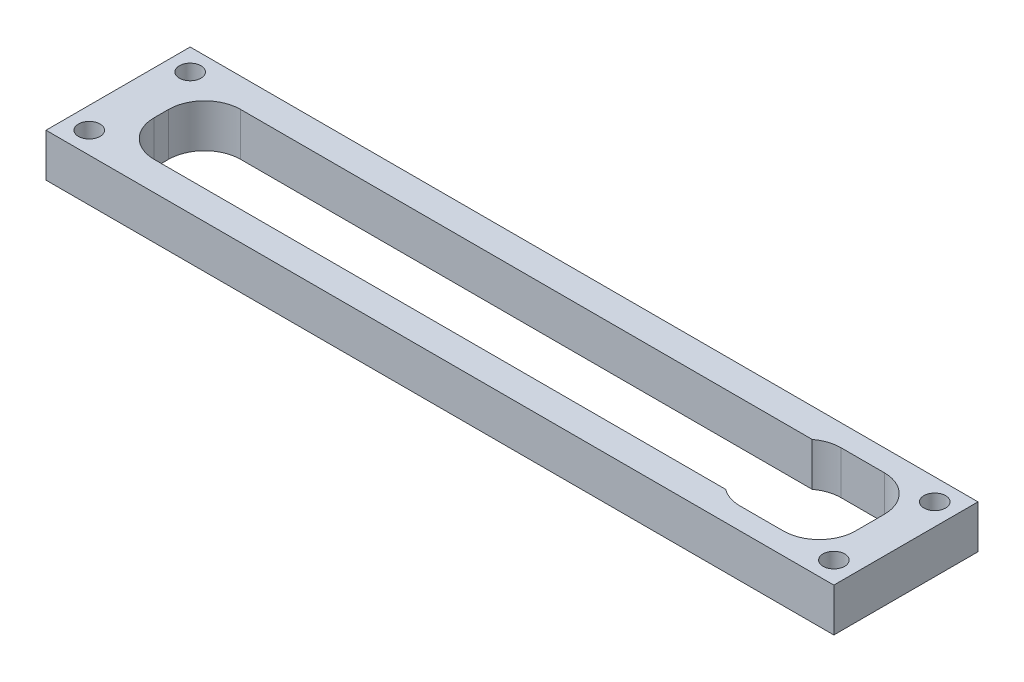
ISO-10303-21;
HEADER;
FILE_DESCRIPTION(('STEP AP214'),'2;1');
FILE_NAME('part.step','',(''),(''),'','','');
FILE_SCHEMA(('AUTOMOTIVE_DESIGN { 1 0 10303 214 1 1 1 1 }'));
ENDSEC;
DATA;
#1=APPLICATION_CONTEXT('core data for automotive mechanical design processes');
#2=APPLICATION_PROTOCOL_DEFINITION('international standard','automotive_design',2000,#1);
#3=PRODUCT_CONTEXT('',#1,'mechanical');
#4=PRODUCT('Part','Part','',(#3));
#5=PRODUCT_RELATED_PRODUCT_CATEGORY('part','',(#4));
#6=PRODUCT_DEFINITION_FORMATION('','',#4);
#7=PRODUCT_DEFINITION_CONTEXT('part definition',#1,'design');
#8=PRODUCT_DEFINITION('design','',#6,#7);
#9=PRODUCT_DEFINITION_SHAPE('','',#8);
#10=(LENGTH_UNIT() NAMED_UNIT(*) SI_UNIT(.MILLI.,.METRE.));
#11=(NAMED_UNIT(*) PLANE_ANGLE_UNIT() SI_UNIT($,.RADIAN.));
#12=(NAMED_UNIT(*) SI_UNIT($,.STERADIAN.) SOLID_ANGLE_UNIT());
#13=UNCERTAINTY_MEASURE_WITH_UNIT(LENGTH_MEASURE(1.E-05),#10,'distance_accuracy_value','');
#14=(GEOMETRIC_REPRESENTATION_CONTEXT(3) GLOBAL_UNCERTAINTY_ASSIGNED_CONTEXT((#13)) GLOBAL_UNIT_ASSIGNED_CONTEXT((#10,
#11,#12)) REPRESENTATION_CONTEXT('',''));
#15=CARTESIAN_POINT('',(0.,0.,0.));
#16=DIRECTION('',(0.,0.,1.));
#17=DIRECTION('',(1.,0.,0.));
#18=AXIS2_PLACEMENT_3D('',#15,#16,#17);
#19=CARTESIAN_POINT('',(0.,6.,0.));
#20=DIRECTION('',(0.,-1.,0.));
#21=DIRECTION('',(0.,0.,-1.));
#22=AXIS2_PLACEMENT_3D('',#19,#20,#21);
#23=PLANE('',#22);
#24=DIRECTION('',(0.,0.,1.));
#25=VECTOR('',#24,1.);
#26=CARTESIAN_POINT('',(0.,6.,0.));
#27=LINE('',#26,#25);
#28=CARTESIAN_POINT('',(0.,6.,-20.));
#29=VERTEX_POINT('',#28);
#30=CARTESIAN_POINT('',(0.,6.,0.));
#31=VERTEX_POINT('',#30);
#32=EDGE_CURVE('E250',#29,#31,#27,.T.);
#33=ORIENTED_EDGE('',*,*,#32,.T.);
#34=DIRECTION('',(1.,0.,0.));
#35=VECTOR('',#34,1.);
#36=CARTESIAN_POINT('',(0.,6.,0.));
#37=LINE('',#36,#35);
#38=CARTESIAN_POINT('',(109.295835398403,6.,0.));
#39=VERTEX_POINT('',#38);
#40=EDGE_CURVE('E253',#31,#39,#37,.T.);
#41=ORIENTED_EDGE('',*,*,#40,.T.);
#42=DIRECTION('',(0.,0.,-1.));
#43=VECTOR('',#42,1.);
#44=CARTESIAN_POINT('',(109.295835398403,6.,0.));
#45=LINE('',#44,#43);
#46=CARTESIAN_POINT('',(109.295835398403,6.,-20.));
#47=VERTEX_POINT('',#46);
#48=EDGE_CURVE('E256',#39,#47,#45,.T.);
#49=ORIENTED_EDGE('',*,*,#48,.T.);
#50=DIRECTION('',(-1.,0.,0.));
#51=VECTOR('',#50,1.);
#52=CARTESIAN_POINT('',(0.,6.,-20.));
#53=LINE('',#52,#51);
#54=EDGE_CURVE('E258',#47,#29,#53,.T.);
#55=ORIENTED_EDGE('',*,*,#54,.T.);
#56=EDGE_LOOP('',(#33,#41,#49,#55));
#57=FACE_BOUND('',#56,.T.);
#58=DIRECTION('',(-1.,0.,0.));
#59=VECTOR('',#58,1.);
#60=CARTESIAN_POINT('',(5.99999999999999,6.,-16.));
#61=LINE('',#60,#59);
#62=CARTESIAN_POINT('',(90.2958353984025,6.,-16.));
#63=VERTEX_POINT('',#62);
#64=CARTESIAN_POINT('',(11.,6.,-16.));
#65=VERTEX_POINT('',#64);
#66=EDGE_CURVE('E243',#63,#65,#61,.T.);
#67=ORIENTED_EDGE('',*,*,#66,.F.);
#68=CARTESIAN_POINT('',(93.2958353984026,6.,-12.));
#69=DIRECTION('',(0.,-1.,0.));
#70=DIRECTION('',(0.,0.,-1.));
#71=AXIS2_PLACEMENT_3D('',#68,#69,#70);
#72=CIRCLE('',#71,5.);
#73=CARTESIAN_POINT('',(93.2958353984026,6.,-17.));
#74=VERTEX_POINT('',#73);
#75=EDGE_CURVE('E193',#63,#74,#72,.T.);
#76=ORIENTED_EDGE('',*,*,#75,.T.);
#77=DIRECTION('',(-1.,0.,0.));
#78=VECTOR('',#77,1.);
#79=CARTESIAN_POINT('',(90.2958353984025,6.,-17.));
#80=LINE('',#79,#78);
#81=CARTESIAN_POINT('',(99.2958353984025,6.,-17.));
#82=VERTEX_POINT('',#81);
#83=EDGE_CURVE('E205',#82,#74,#80,.T.);
#84=ORIENTED_EDGE('',*,*,#83,.F.);
#85=CARTESIAN_POINT('',(99.2958353984025,6.,-12.));
#86=DIRECTION('',(0.,-1.,0.));
#87=DIRECTION('',(0.,0.,-1.));
#88=AXIS2_PLACEMENT_3D('',#85,#86,#87);
#89=CIRCLE('',#88,5.);
#90=CARTESIAN_POINT('',(104.295835398403,6.,-12.));
#91=VERTEX_POINT('',#90);
#92=EDGE_CURVE('E185',#82,#91,#89,.T.);
#93=ORIENTED_EDGE('',*,*,#92,.T.);
#94=DIRECTION('',(0.,0.,-1.));
#95=VECTOR('',#94,1.);
#96=CARTESIAN_POINT('',(104.295835398403,6.,-17.));
#97=LINE('',#96,#95);
#98=CARTESIAN_POINT('',(104.295835398403,6.,-8.00000000000001));
#99=VERTEX_POINT('',#98);
#100=EDGE_CURVE('E202',#99,#91,#97,.T.);
#101=ORIENTED_EDGE('',*,*,#100,.F.);
#102=CARTESIAN_POINT('',(99.2958353984025,6.,-8.00000000000001));
#103=DIRECTION('',(0.,-1.,0.));
#104=DIRECTION('',(0.,0.,-1.));
#105=AXIS2_PLACEMENT_3D('',#102,#103,#104);
#106=CIRCLE('',#105,5.);
#107=CARTESIAN_POINT('',(99.2958353984025,6.,-3.00000000000001));
#108=VERTEX_POINT('',#107);
#109=EDGE_CURVE('E189',#99,#108,#106,.T.);
#110=ORIENTED_EDGE('',*,*,#109,.T.);
#111=DIRECTION('',(1.,0.,0.));
#112=VECTOR('',#111,1.);
#113=CARTESIAN_POINT('',(90.2958353984025,6.,-3.));
#114=LINE('',#113,#112);
#115=CARTESIAN_POINT('',(93.2958353984026,6.,-3.00000000000001));
#116=VERTEX_POINT('',#115);
#117=EDGE_CURVE('E200',#116,#108,#114,.T.);
#118=ORIENTED_EDGE('',*,*,#117,.F.);
#119=CARTESIAN_POINT('',(93.2958353984026,6.,-8.00000000000001));
#120=DIRECTION('',(0.,-1.,0.));
#121=DIRECTION('',(0.,0.,-1.));
#122=AXIS2_PLACEMENT_3D('',#119,#120,#121);
#123=CIRCLE('',#122,5.);
#124=CARTESIAN_POINT('',(90.2958353984025,6.,-4.00000000000002));
#125=VERTEX_POINT('',#124);
#126=EDGE_CURVE('E43',#116,#125,#123,.T.);
#127=ORIENTED_EDGE('',*,*,#126,.T.);
#128=DIRECTION('',(1.,0.,0.));
#129=VECTOR('',#128,1.);
#130=CARTESIAN_POINT('',(5.99999999999999,6.,-4.00000000000002));
#131=LINE('',#130,#129);
#132=CARTESIAN_POINT('',(11.,6.,-4.00000000000002));
#133=VERTEX_POINT('',#132);
#134=EDGE_CURVE('E162',#133,#125,#131,.T.);
#135=ORIENTED_EDGE('',*,*,#134,.F.);
#136=CARTESIAN_POINT('',(11.,6.,-9.00000000000001));
#137=DIRECTION('',(0.,-1.,0.));
#138=DIRECTION('',(0.,0.,-1.));
#139=AXIS2_PLACEMENT_3D('',#136,#137,#138);
#140=CIRCLE('',#139,5.);
#141=CARTESIAN_POINT('',(5.99999999999999,6.,-9.00000000000001));
#142=VERTEX_POINT('',#141);
#143=EDGE_CURVE('E179',#133,#142,#140,.T.);
#144=ORIENTED_EDGE('',*,*,#143,.T.);
#145=DIRECTION('',(0.,0.,1.));
#146=VECTOR('',#145,1.);
#147=CARTESIAN_POINT('',(5.99999999999999,6.,-16.));
#148=LINE('',#147,#146);
#149=CARTESIAN_POINT('',(5.99999999999999,6.,-11.));
#150=VERTEX_POINT('',#149);
#151=EDGE_CURVE('E239',#150,#142,#148,.T.);
#152=ORIENTED_EDGE('',*,*,#151,.F.);
#153=CARTESIAN_POINT('',(11.,6.,-11.));
#154=DIRECTION('',(0.,-1.,0.));
#155=DIRECTION('',(0.,0.,-1.));
#156=AXIS2_PLACEMENT_3D('',#153,#154,#155);
#157=CIRCLE('',#156,5.);
#158=EDGE_CURVE('E183',#150,#65,#157,.T.);
#159=ORIENTED_EDGE('',*,*,#158,.T.);
#160=EDGE_LOOP('',(#67,#76,#84,#93,#101,#110,#118,#127,#135,#144,#152,#159));
#161=FACE_BOUND('',#160,.T.);
#162=CARTESIAN_POINT('',(3.,6.,-17.));
#163=DIRECTION('',(0.,1.,0.));
#164=DIRECTION('',(0.,0.,1.));
#165=AXIS2_PLACEMENT_3D('',#162,#163,#164);
#166=CIRCLE('',#165,1.5);
#167=CARTESIAN_POINT('',(3.,6.,-15.5));
#168=VERTEX_POINT('',#167);
#169=EDGE_CURVE('E234',#168,#168,#166,.T.);
#170=ORIENTED_EDGE('',*,*,#169,.F.);
#171=EDGE_LOOP('',(#170));
#172=FACE_BOUND('',#171,.T.);
#173=CARTESIAN_POINT('',(3.,6.,-3.));
#174=DIRECTION('',(0.,1.,0.));
#175=DIRECTION('',(0.,0.,-1.));
#176=AXIS2_PLACEMENT_3D('',#173,#174,#175);
#177=CIRCLE('',#176,1.5);
#178=CARTESIAN_POINT('',(3.,6.,-4.5));
#179=VERTEX_POINT('',#178);
#180=EDGE_CURVE('E228',#179,#179,#177,.T.);
#181=ORIENTED_EDGE('',*,*,#180,.F.);
#182=EDGE_LOOP('',(#181));
#183=FACE_BOUND('',#182,.T.);
#184=CARTESIAN_POINT('',(106.295835398403,6.,-3.00000000000001));
#185=DIRECTION('',(0.,1.,0.));
#186=DIRECTION('',(0.,0.,1.));
#187=AXIS2_PLACEMENT_3D('',#184,#185,#186);
#188=CIRCLE('',#187,1.5);
#189=CARTESIAN_POINT('',(106.295835398403,6.,-1.50000000000001));
#190=VERTEX_POINT('',#189);
#191=EDGE_CURVE('E222',#190,#190,#188,.T.);
#192=ORIENTED_EDGE('',*,*,#191,.F.);
#193=EDGE_LOOP('',(#192));
#194=FACE_BOUND('',#193,.T.);
#195=CARTESIAN_POINT('',(106.295835398403,6.,-17.));
#196=DIRECTION('',(0.,1.,0.));
#197=DIRECTION('',(0.,0.,-1.));
#198=AXIS2_PLACEMENT_3D('',#195,#196,#197);
#199=CIRCLE('',#198,1.5);
#200=CARTESIAN_POINT('',(106.295835398403,6.,-18.5));
#201=VERTEX_POINT('',#200);
#202=EDGE_CURVE('E216',#201,#201,#199,.T.);
#203=ORIENTED_EDGE('',*,*,#202,.F.);
#204=EDGE_LOOP('',(#203));
#205=FACE_BOUND('',#204,.T.);
#206=ADVANCED_FACE('F35',(#57,#161,#172,#183,#194,#205),#23,.F.);
#207=CARTESIAN_POINT('',(0.,0.,0.));
#208=DIRECTION('',(0.,-1.,0.));
#209=DIRECTION('',(0.,0.,-1.));
#210=AXIS2_PLACEMENT_3D('',#207,#208,#209);
#211=PLANE('',#210);
#212=DIRECTION('',(-1.,0.,0.));
#213=VECTOR('',#212,1.);
#214=CARTESIAN_POINT('',(90.2958353984025,0.,-17.));
#215=LINE('',#214,#213);
#216=CARTESIAN_POINT('',(99.2958353984025,0.,-17.));
#217=VERTEX_POINT('',#216);
#218=CARTESIAN_POINT('',(93.2958353984026,0.,-17.));
#219=VERTEX_POINT('',#218);
#220=EDGE_CURVE('E165',#217,#219,#215,.T.);
#221=ORIENTED_EDGE('',*,*,#220,.T.);
#222=CARTESIAN_POINT('',(93.2958353984026,0.,-12.));
#223=DIRECTION('',(0.,-1.,0.));
#224=DIRECTION('',(0.,0.,-1.));
#225=AXIS2_PLACEMENT_3D('',#222,#223,#224);
#226=CIRCLE('',#225,5.);
#227=CARTESIAN_POINT('',(90.2958353984025,0.,-16.));
#228=VERTEX_POINT('',#227);
#229=EDGE_CURVE('E195',#219,#228,#226,.F.);
#230=ORIENTED_EDGE('',*,*,#229,.T.);
#231=DIRECTION('',(-1.,0.,0.));
#232=VECTOR('',#231,1.);
#233=CARTESIAN_POINT('',(5.99999999999999,0.,-16.));
#234=LINE('',#233,#232);
#235=CARTESIAN_POINT('',(11.,0.,-16.));
#236=VERTEX_POINT('',#235);
#237=EDGE_CURVE('E154',#228,#236,#234,.T.);
#238=ORIENTED_EDGE('',*,*,#237,.T.);
#239=CARTESIAN_POINT('',(11.,0.,-11.));
#240=DIRECTION('',(0.,-1.,0.));
#241=DIRECTION('',(0.,0.,-1.));
#242=AXIS2_PLACEMENT_3D('',#239,#240,#241);
#243=CIRCLE('',#242,5.);
#244=CARTESIAN_POINT('',(5.99999999999999,0.,-11.));
#245=VERTEX_POINT('',#244);
#246=EDGE_CURVE('E181',#236,#245,#243,.F.);
#247=ORIENTED_EDGE('',*,*,#246,.T.);
#248=DIRECTION('',(0.,0.,1.));
#249=VECTOR('',#248,1.);
#250=CARTESIAN_POINT('',(5.99999999999999,0.,-16.));
#251=LINE('',#250,#249);
#252=CARTESIAN_POINT('',(5.99999999999999,0.,-9.00000000000001));
#253=VERTEX_POINT('',#252);
#254=EDGE_CURVE('E155',#245,#253,#251,.T.);
#255=ORIENTED_EDGE('',*,*,#254,.T.);
#256=CARTESIAN_POINT('',(11.,0.,-9.00000000000001));
#257=DIRECTION('',(0.,-1.,0.));
#258=DIRECTION('',(0.,0.,-1.));
#259=AXIS2_PLACEMENT_3D('',#256,#257,#258);
#260=CIRCLE('',#259,5.);
#261=CARTESIAN_POINT('',(11.,0.,-4.00000000000002));
#262=VERTEX_POINT('',#261);
#263=EDGE_CURVE('E151',#253,#262,#260,.F.);
#264=ORIENTED_EDGE('',*,*,#263,.T.);
#265=DIRECTION('',(1.,0.,0.));
#266=VECTOR('',#265,1.);
#267=CARTESIAN_POINT('',(5.99999999999999,0.,-4.00000000000002));
#268=LINE('',#267,#266);
#269=CARTESIAN_POINT('',(90.2958353984025,0.,-4.00000000000002));
#270=VERTEX_POINT('',#269);
#271=EDGE_CURVE('E145',#262,#270,#268,.T.);
#272=ORIENTED_EDGE('',*,*,#271,.T.);
#273=CARTESIAN_POINT('',(93.2958353984026,0.,-8.00000000000001));
#274=DIRECTION('',(0.,-1.,0.));
#275=DIRECTION('',(0.,0.,-1.));
#276=AXIS2_PLACEMENT_3D('',#273,#274,#275);
#277=CIRCLE('',#276,5.);
#278=CARTESIAN_POINT('',(93.2958353984026,0.,-3.00000000000001));
#279=VERTEX_POINT('',#278);
#280=EDGE_CURVE('E11',#270,#279,#277,.F.);
#281=ORIENTED_EDGE('',*,*,#280,.T.);
#282=DIRECTION('',(1.,0.,0.));
#283=VECTOR('',#282,1.);
#284=CARTESIAN_POINT('',(90.2958353984025,0.,-3.));
#285=LINE('',#284,#283);
#286=CARTESIAN_POINT('',(99.2958353984025,0.,-3.00000000000001));
#287=VERTEX_POINT('',#286);
#288=EDGE_CURVE('E212',#279,#287,#285,.T.);
#289=ORIENTED_EDGE('',*,*,#288,.T.);
#290=CARTESIAN_POINT('',(99.2958353984025,0.,-8.00000000000001));
#291=DIRECTION('',(0.,-1.,0.));
#292=DIRECTION('',(0.,0.,-1.));
#293=AXIS2_PLACEMENT_3D('',#290,#291,#292);
#294=CIRCLE('',#293,5.);
#295=CARTESIAN_POINT('',(104.295835398403,0.,-8.00000000000001));
#296=VERTEX_POINT('',#295);
#297=EDGE_CURVE('E191',#287,#296,#294,.F.);
#298=ORIENTED_EDGE('',*,*,#297,.T.);
#299=DIRECTION('',(0.,0.,-1.));
#300=VECTOR('',#299,1.);
#301=CARTESIAN_POINT('',(104.295835398403,0.,-17.));
#302=LINE('',#301,#300);
#303=CARTESIAN_POINT('',(104.295835398403,0.,-12.));
#304=VERTEX_POINT('',#303);
#305=EDGE_CURVE('E300',#296,#304,#302,.T.);
#306=ORIENTED_EDGE('',*,*,#305,.T.);
#307=CARTESIAN_POINT('',(99.2958353984025,0.,-12.));
#308=DIRECTION('',(0.,-1.,0.));
#309=DIRECTION('',(0.,0.,-1.));
#310=AXIS2_PLACEMENT_3D('',#307,#308,#309);
#311=CIRCLE('',#310,5.);
#312=EDGE_CURVE('E187',#304,#217,#311,.F.);
#313=ORIENTED_EDGE('',*,*,#312,.T.);
#314=EDGE_LOOP('',(#221,#230,#238,#247,#255,#264,#272,#281,#289,#298,#306,#313));
#315=FACE_BOUND('',#314,.T.);
#316=CARTESIAN_POINT('',(106.295835398403,0.,-3.00000000000001));
#317=DIRECTION('',(0.,1.,0.));
#318=DIRECTION('',(0.,0.,1.));
#319=AXIS2_PLACEMENT_3D('',#316,#317,#318);
#320=CIRCLE('',#319,1.5);
#321=CARTESIAN_POINT('',(106.295835398403,0.,-1.50000000000001));
#322=VERTEX_POINT('',#321);
#323=EDGE_CURVE('E219',#322,#322,#320,.T.);
#324=ORIENTED_EDGE('',*,*,#323,.T.);
#325=EDGE_LOOP('',(#324));
#326=FACE_BOUND('',#325,.T.);
#327=CARTESIAN_POINT('',(3.,0.,-17.));
#328=DIRECTION('',(0.,1.,0.));
#329=DIRECTION('',(0.,0.,1.));
#330=AXIS2_PLACEMENT_3D('',#327,#328,#329);
#331=CIRCLE('',#330,1.5);
#332=CARTESIAN_POINT('',(3.,0.,-15.5));
#333=VERTEX_POINT('',#332);
#334=EDGE_CURVE('E231',#333,#333,#331,.T.);
#335=ORIENTED_EDGE('',*,*,#334,.T.);
#336=EDGE_LOOP('',(#335));
#337=FACE_BOUND('',#336,.T.);
#338=DIRECTION('',(0.,0.,1.));
#339=VECTOR('',#338,1.);
#340=CARTESIAN_POINT('',(0.,0.,0.));
#341=LINE('',#340,#339);
#342=CARTESIAN_POINT('',(0.,0.,-20.));
#343=VERTEX_POINT('',#342);
#344=CARTESIAN_POINT('',(0.,0.,0.));
#345=VERTEX_POINT('',#344);
#346=EDGE_CURVE('E246',#343,#345,#341,.T.);
#347=ORIENTED_EDGE('',*,*,#346,.F.);
#348=DIRECTION('',(-1.,0.,0.));
#349=VECTOR('',#348,1.);
#350=CARTESIAN_POINT('',(0.,0.,-20.));
#351=LINE('',#350,#349);
#352=CARTESIAN_POINT('',(109.295835398403,0.,-20.));
#353=VERTEX_POINT('',#352);
#354=EDGE_CURVE('E254',#353,#343,#351,.T.);
#355=ORIENTED_EDGE('',*,*,#354,.F.);
#356=DIRECTION('',(0.,0.,-1.));
#357=VECTOR('',#356,1.);
#358=CARTESIAN_POINT('',(109.295835398403,0.,0.));
#359=LINE('',#358,#357);
#360=CARTESIAN_POINT('',(109.295835398403,0.,0.));
#361=VERTEX_POINT('',#360);
#362=EDGE_CURVE('E265',#361,#353,#359,.T.);
#363=ORIENTED_EDGE('',*,*,#362,.F.);
#364=DIRECTION('',(1.,0.,0.));
#365=VECTOR('',#364,1.);
#366=CARTESIAN_POINT('',(0.,0.,0.));
#367=LINE('',#366,#365);
#368=EDGE_CURVE('E263',#345,#361,#367,.T.);
#369=ORIENTED_EDGE('',*,*,#368,.F.);
#370=EDGE_LOOP('',(#347,#355,#363,#369));
#371=FACE_BOUND('',#370,.T.);
#372=CARTESIAN_POINT('',(3.,0.,-3.));
#373=DIRECTION('',(0.,1.,0.));
#374=DIRECTION('',(0.,0.,-1.));
#375=AXIS2_PLACEMENT_3D('',#372,#373,#374);
#376=CIRCLE('',#375,1.5);
#377=CARTESIAN_POINT('',(3.,0.,-4.5));
#378=VERTEX_POINT('',#377);
#379=EDGE_CURVE('E225',#378,#378,#376,.T.);
#380=ORIENTED_EDGE('',*,*,#379,.T.);
#381=EDGE_LOOP('',(#380));
#382=FACE_BOUND('',#381,.T.);
#383=CARTESIAN_POINT('',(106.295835398403,0.,-17.));
#384=DIRECTION('',(0.,1.,0.));
#385=DIRECTION('',(0.,0.,-1.));
#386=AXIS2_PLACEMENT_3D('',#383,#384,#385);
#387=CIRCLE('',#386,1.5);
#388=CARTESIAN_POINT('',(106.295835398403,0.,-18.5));
#389=VERTEX_POINT('',#388);
#390=EDGE_CURVE('E214',#389,#389,#387,.T.);
#391=ORIENTED_EDGE('',*,*,#390,.T.);
#392=EDGE_LOOP('',(#391));
#393=FACE_BOUND('',#392,.T.);
#394=ADVANCED_FACE('F148',(#315,#326,#337,#371,#382,#393),#211,.T.);
#395=CARTESIAN_POINT('',(0.,6.,0.));
#396=DIRECTION('',(1.,0.,0.));
#397=DIRECTION('',(0.,0.,-1.));
#398=AXIS2_PLACEMENT_3D('',#395,#396,#397);
#399=PLANE('',#398);
#400=ORIENTED_EDGE('',*,*,#346,.T.);
#401=DIRECTION('',(0.,-1.,0.));
#402=VECTOR('',#401,1.);
#403=CARTESIAN_POINT('',(0.,6.,0.));
#404=LINE('',#403,#402);
#405=EDGE_CURVE('E276',#31,#345,#404,.T.);
#406=ORIENTED_EDGE('',*,*,#405,.F.);
#407=ORIENTED_EDGE('',*,*,#32,.F.);
#408=DIRECTION('',(0.,-1.,0.));
#409=VECTOR('',#408,1.);
#410=CARTESIAN_POINT('',(0.,6.,-20.));
#411=LINE('',#410,#409);
#412=EDGE_CURVE('E260',#29,#343,#411,.T.);
#413=ORIENTED_EDGE('',*,*,#412,.T.);
#414=EDGE_LOOP('',(#400,#406,#407,#413));
#415=FACE_BOUND('',#414,.T.);
#416=ADVANCED_FACE('F331',(#415),#399,.F.);
#417=CARTESIAN_POINT('',(0.,6.,0.));
#418=DIRECTION('',(0.,0.,-1.));
#419=DIRECTION('',(-1.,0.,0.));
#420=AXIS2_PLACEMENT_3D('',#417,#418,#419);
#421=PLANE('',#420);
#422=ORIENTED_EDGE('',*,*,#368,.T.);
#423=DIRECTION('',(0.,-1.,0.));
#424=VECTOR('',#423,1.);
#425=CARTESIAN_POINT('',(109.295835398403,6.,0.));
#426=LINE('',#425,#424);
#427=EDGE_CURVE('E273',#39,#361,#426,.T.);
#428=ORIENTED_EDGE('',*,*,#427,.F.);
#429=ORIENTED_EDGE('',*,*,#40,.F.);
#430=ORIENTED_EDGE('',*,*,#405,.T.);
#431=EDGE_LOOP('',(#422,#428,#429,#430));
#432=FACE_BOUND('',#431,.T.);
#433=ADVANCED_FACE('F344',(#432),#421,.F.);
#434=CARTESIAN_POINT('',(109.295835398403,6.,0.));
#435=DIRECTION('',(-1.,0.,0.));
#436=DIRECTION('',(0.,0.,1.));
#437=AXIS2_PLACEMENT_3D('',#434,#435,#436);
#438=PLANE('',#437);
#439=ORIENTED_EDGE('',*,*,#362,.T.);
#440=DIRECTION('',(0.,-1.,0.));
#441=VECTOR('',#440,1.);
#442=CARTESIAN_POINT('',(109.295835398403,6.,-20.));
#443=LINE('',#442,#441);
#444=EDGE_CURVE('E270',#47,#353,#443,.T.);
#445=ORIENTED_EDGE('',*,*,#444,.F.);
#446=ORIENTED_EDGE('',*,*,#48,.F.);
#447=ORIENTED_EDGE('',*,*,#427,.T.);
#448=EDGE_LOOP('',(#439,#445,#446,#447));
#449=FACE_BOUND('',#448,.T.);
#450=ADVANCED_FACE('F340',(#449),#438,.F.);
#451=CARTESIAN_POINT('',(0.,6.,-20.));
#452=DIRECTION('',(0.,0.,1.));
#453=DIRECTION('',(1.,0.,0.));
#454=AXIS2_PLACEMENT_3D('',#451,#452,#453);
#455=PLANE('',#454);
#456=ORIENTED_EDGE('',*,*,#354,.T.);
#457=ORIENTED_EDGE('',*,*,#412,.F.);
#458=ORIENTED_EDGE('',*,*,#54,.F.);
#459=ORIENTED_EDGE('',*,*,#444,.T.);
#460=EDGE_LOOP('',(#456,#457,#458,#459));
#461=FACE_BOUND('',#460,.T.);
#462=ADVANCED_FACE('F337',(#461),#455,.F.);
#463=CARTESIAN_POINT('',(5.99999999999999,6.,-16.));
#464=DIRECTION('',(1.,0.,0.));
#465=DIRECTION('',(0.,0.,-1.));
#466=AXIS2_PLACEMENT_3D('',#463,#464,#465);
#467=PLANE('',#466);
#468=ORIENTED_EDGE('',*,*,#151,.T.);
#469=DIRECTION('',(0.,-1.,0.));
#470=VECTOR('',#469,1.);
#471=CARTESIAN_POINT('',(5.99999999999999,0.,-9.00000000000001));
#472=LINE('',#471,#470);
#473=EDGE_CURVE('E281',#142,#253,#472,.T.);
#474=ORIENTED_EDGE('',*,*,#473,.T.);
#475=ORIENTED_EDGE('',*,*,#254,.F.);
#476=DIRECTION('',(0.,-1.,0.));
#477=VECTOR('',#476,1.);
#478=CARTESIAN_POINT('',(5.99999999999999,6.,-11.));
#479=LINE('',#478,#477);
#480=EDGE_CURVE('E279',#245,#150,#479,.F.);
#481=ORIENTED_EDGE('',*,*,#480,.T.);
#482=EDGE_LOOP('',(#468,#474,#475,#481));
#483=FACE_BOUND('',#482,.T.);
#484=ADVANCED_FACE('F334',(#483),#467,.T.);
#485=CARTESIAN_POINT('',(5.99999999999999,6.,-4.00000000000002));
#486=DIRECTION('',(0.,0.,-1.));
#487=DIRECTION('',(-1.,0.,0.));
#488=AXIS2_PLACEMENT_3D('',#485,#486,#487);
#489=PLANE('',#488);
#490=ORIENTED_EDGE('',*,*,#271,.F.);
#491=DIRECTION('',(0.,-1.,0.));
#492=VECTOR('',#491,1.);
#493=CARTESIAN_POINT('',(11.,6.,-4.00000000000002));
#494=LINE('',#493,#492);
#495=EDGE_CURVE('E284',#262,#133,#494,.F.);
#496=ORIENTED_EDGE('',*,*,#495,.T.);
#497=ORIENTED_EDGE('',*,*,#134,.T.);
#498=DIRECTION('',(0.,1.,0.));
#499=VECTOR('',#498,1.);
#500=CARTESIAN_POINT('',(90.2958353984025,0.,-4.00000000000002));
#501=LINE('',#500,#499);
#502=EDGE_CURVE('E159',#270,#125,#501,.T.);
#503=ORIENTED_EDGE('',*,*,#502,.F.);
#504=EDGE_LOOP('',(#490,#496,#497,#503));
#505=FACE_BOUND('',#504,.T.);
#506=ADVANCED_FACE('F160',(#505),#489,.T.);
#507=CARTESIAN_POINT('',(5.99999999999999,6.,-16.));
#508=DIRECTION('',(0.,0.,1.));
#509=DIRECTION('',(1.,0.,0.));
#510=AXIS2_PLACEMENT_3D('',#507,#508,#509);
#511=PLANE('',#510);
#512=ORIENTED_EDGE('',*,*,#66,.T.);
#513=DIRECTION('',(0.,-1.,0.));
#514=VECTOR('',#513,1.);
#515=CARTESIAN_POINT('',(11.,0.,-16.));
#516=LINE('',#515,#514);
#517=EDGE_CURVE('E286',#65,#236,#516,.T.);
#518=ORIENTED_EDGE('',*,*,#517,.T.);
#519=ORIENTED_EDGE('',*,*,#237,.F.);
#520=DIRECTION('',(0.,1.,0.));
#521=VECTOR('',#520,1.);
#522=CARTESIAN_POINT('',(90.2958353984025,0.,-16.));
#523=LINE('',#522,#521);
#524=EDGE_CURVE('E164',#228,#63,#523,.T.);
#525=ORIENTED_EDGE('',*,*,#524,.T.);
#526=EDGE_LOOP('',(#512,#518,#519,#525));
#527=FACE_BOUND('',#526,.T.);
#528=ADVANCED_FACE('F366',(#527),#511,.T.);
#529=CARTESIAN_POINT('',(3.,6.,-17.));
#530=DIRECTION('',(0.,-1.,0.));
#531=DIRECTION('',(0.,0.,-1.));
#532=AXIS2_PLACEMENT_3D('',#529,#530,#531);
#533=CYLINDRICAL_SURFACE('',#532,1.5);
#534=ORIENTED_EDGE('',*,*,#169,.T.);
#535=EDGE_LOOP('',(#534));
#536=FACE_BOUND('',#535,.T.);
#537=ORIENTED_EDGE('',*,*,#334,.F.);
#538=EDGE_LOOP('',(#537));
#539=FACE_BOUND('',#538,.T.);
#540=ADVANCED_FACE('F379',(#536,#539),#533,.F.);
#541=CARTESIAN_POINT('',(3.,6.,-3.));
#542=DIRECTION('',(0.,-1.,0.));
#543=DIRECTION('',(0.,0.,-1.));
#544=AXIS2_PLACEMENT_3D('',#541,#542,#543);
#545=CYLINDRICAL_SURFACE('',#544,1.5);
#546=ORIENTED_EDGE('',*,*,#180,.T.);
#547=EDGE_LOOP('',(#546));
#548=FACE_BOUND('',#547,.T.);
#549=ORIENTED_EDGE('',*,*,#379,.F.);
#550=EDGE_LOOP('',(#549));
#551=FACE_BOUND('',#550,.T.);
#552=ADVANCED_FACE('F384',(#548,#551),#545,.F.);
#553=CARTESIAN_POINT('',(106.295835398403,6.,-3.00000000000001));
#554=DIRECTION('',(0.,-1.,0.));
#555=DIRECTION('',(0.,0.,-1.));
#556=AXIS2_PLACEMENT_3D('',#553,#554,#555);
#557=CYLINDRICAL_SURFACE('',#556,1.5);
#558=ORIENTED_EDGE('',*,*,#191,.T.);
#559=EDGE_LOOP('',(#558));
#560=FACE_BOUND('',#559,.T.);
#561=ORIENTED_EDGE('',*,*,#323,.F.);
#562=EDGE_LOOP('',(#561));
#563=FACE_BOUND('',#562,.T.);
#564=ADVANCED_FACE('F388',(#560,#563),#557,.F.);
#565=CARTESIAN_POINT('',(106.295835398403,6.,-17.));
#566=DIRECTION('',(0.,-1.,0.));
#567=DIRECTION('',(0.,0.,-1.));
#568=AXIS2_PLACEMENT_3D('',#565,#566,#567);
#569=CYLINDRICAL_SURFACE('',#568,1.5);
#570=ORIENTED_EDGE('',*,*,#202,.T.);
#571=EDGE_LOOP('',(#570));
#572=FACE_BOUND('',#571,.T.);
#573=ORIENTED_EDGE('',*,*,#390,.F.);
#574=EDGE_LOOP('',(#573));
#575=FACE_BOUND('',#574,.T.);
#576=ADVANCED_FACE('F392',(#572,#575),#569,.F.);
#577=CARTESIAN_POINT('',(90.2958353984025,0.,-17.));
#578=DIRECTION('',(0.,0.,-1.));
#579=DIRECTION('',(-1.,0.,0.));
#580=AXIS2_PLACEMENT_3D('',#577,#578,#579);
#581=PLANE('',#580);
#582=ORIENTED_EDGE('',*,*,#220,.F.);
#583=DIRECTION('',(0.,1.,0.));
#584=VECTOR('',#583,1.);
#585=CARTESIAN_POINT('',(99.2958353984025,6.,-17.));
#586=LINE('',#585,#584);
#587=EDGE_CURVE('E291',#217,#82,#586,.T.);
#588=ORIENTED_EDGE('',*,*,#587,.T.);
#589=ORIENTED_EDGE('',*,*,#83,.T.);
#590=DIRECTION('',(0.,1.,0.));
#591=VECTOR('',#590,1.);
#592=CARTESIAN_POINT('',(93.2958353984026,0.,-17.));
#593=LINE('',#592,#591);
#594=EDGE_CURVE('E289',#74,#219,#593,.F.);
#595=ORIENTED_EDGE('',*,*,#594,.T.);
#596=EDGE_LOOP('',(#582,#588,#589,#595));
#597=FACE_BOUND('',#596,.T.);
#598=ADVANCED_FACE('F310',(#597),#581,.F.);
#599=CARTESIAN_POINT('',(104.295835398403,0.,-17.));
#600=DIRECTION('',(1.,0.,0.));
#601=DIRECTION('',(0.,0.,-1.));
#602=AXIS2_PLACEMENT_3D('',#599,#600,#601);
#603=PLANE('',#602);
#604=ORIENTED_EDGE('',*,*,#100,.T.);
#605=DIRECTION('',(0.,1.,0.));
#606=VECTOR('',#605,1.);
#607=CARTESIAN_POINT('',(104.295835398403,0.,-12.));
#608=LINE('',#607,#606);
#609=EDGE_CURVE('E171',#91,#304,#608,.F.);
#610=ORIENTED_EDGE('',*,*,#609,.T.);
#611=ORIENTED_EDGE('',*,*,#305,.F.);
#612=DIRECTION('',(0.,1.,0.));
#613=VECTOR('',#612,1.);
#614=CARTESIAN_POINT('',(104.295835398403,6.,-8.00000000000001));
#615=LINE('',#614,#613);
#616=EDGE_CURVE('E174',#296,#99,#615,.T.);
#617=ORIENTED_EDGE('',*,*,#616,.T.);
#618=EDGE_LOOP('',(#604,#610,#611,#617));
#619=FACE_BOUND('',#618,.T.);
#620=ADVANCED_FACE('F297',(#619),#603,.F.);
#621=CARTESIAN_POINT('',(90.2958353984025,0.,-3.));
#622=DIRECTION('',(0.,0.,1.));
#623=DIRECTION('',(1.,0.,0.));
#624=AXIS2_PLACEMENT_3D('',#621,#622,#623);
#625=PLANE('',#624);
#626=ORIENTED_EDGE('',*,*,#117,.T.);
#627=DIRECTION('',(0.,1.,0.));
#628=VECTOR('',#627,1.);
#629=CARTESIAN_POINT('',(99.2958353984025,0.,-3.00000000000001));
#630=LINE('',#629,#628);
#631=EDGE_CURVE('E50',#108,#287,#630,.F.);
#632=ORIENTED_EDGE('',*,*,#631,.T.);
#633=ORIENTED_EDGE('',*,*,#288,.F.);
#634=DIRECTION('',(0.,-1.,0.));
#635=VECTOR('',#634,1.);
#636=CARTESIAN_POINT('',(93.2958353984026,0.,-3.00000000000001));
#637=LINE('',#636,#635);
#638=EDGE_CURVE('E169',#279,#116,#637,.F.);
#639=ORIENTED_EDGE('',*,*,#638,.T.);
#640=EDGE_LOOP('',(#626,#632,#633,#639));
#641=FACE_BOUND('',#640,.T.);
#642=ADVANCED_FACE('F355',(#641),#625,.F.);
#643=CARTESIAN_POINT('',(11.,6.,-9.00000000000001));
#644=DIRECTION('',(0.,1.,0.));
#645=DIRECTION('',(0.,0.,1.));
#646=AXIS2_PLACEMENT_3D('',#643,#644,#645);
#647=CYLINDRICAL_SURFACE('',#646,5.);
#648=ORIENTED_EDGE('',*,*,#143,.F.);
#649=ORIENTED_EDGE('',*,*,#495,.F.);
#650=ORIENTED_EDGE('',*,*,#263,.F.);
#651=ORIENTED_EDGE('',*,*,#473,.F.);
#652=EDGE_LOOP('',(#648,#649,#650,#651));
#653=FACE_BOUND('',#652,.T.);
#654=ADVANCED_FACE('F352',(#653),#647,.F.);
#655=CARTESIAN_POINT('',(11.,6.,-11.));
#656=DIRECTION('',(0.,1.,0.));
#657=DIRECTION('',(0.,0.,1.));
#658=AXIS2_PLACEMENT_3D('',#655,#656,#657);
#659=CYLINDRICAL_SURFACE('',#658,5.);
#660=ORIENTED_EDGE('',*,*,#158,.F.);
#661=ORIENTED_EDGE('',*,*,#480,.F.);
#662=ORIENTED_EDGE('',*,*,#246,.F.);
#663=ORIENTED_EDGE('',*,*,#517,.F.);
#664=EDGE_LOOP('',(#660,#661,#662,#663));
#665=FACE_BOUND('',#664,.T.);
#666=ADVANCED_FACE('F323',(#665),#659,.F.);
#667=CARTESIAN_POINT('',(99.2958353984025,0.,-12.));
#668=DIRECTION('',(0.,-1.,0.));
#669=DIRECTION('',(0.,0.,-1.));
#670=AXIS2_PLACEMENT_3D('',#667,#668,#669);
#671=CYLINDRICAL_SURFACE('',#670,5.);
#672=ORIENTED_EDGE('',*,*,#312,.F.);
#673=ORIENTED_EDGE('',*,*,#609,.F.);
#674=ORIENTED_EDGE('',*,*,#92,.F.);
#675=ORIENTED_EDGE('',*,*,#587,.F.);
#676=EDGE_LOOP('',(#672,#673,#674,#675));
#677=FACE_BOUND('',#676,.T.);
#678=ADVANCED_FACE('F307',(#677),#671,.F.);
#679=CARTESIAN_POINT('',(99.2958353984025,0.,-8.00000000000001));
#680=DIRECTION('',(0.,-1.,0.));
#681=DIRECTION('',(0.,0.,-1.));
#682=AXIS2_PLACEMENT_3D('',#679,#680,#681);
#683=CYLINDRICAL_SURFACE('',#682,5.);
#684=ORIENTED_EDGE('',*,*,#297,.F.);
#685=ORIENTED_EDGE('',*,*,#631,.F.);
#686=ORIENTED_EDGE('',*,*,#109,.F.);
#687=ORIENTED_EDGE('',*,*,#616,.F.);
#688=EDGE_LOOP('',(#684,#685,#686,#687));
#689=FACE_BOUND('',#688,.T.);
#690=ADVANCED_FACE('F314',(#689),#683,.F.);
#691=CARTESIAN_POINT('',(93.2958353984026,0.,-12.));
#692=DIRECTION('',(0.,1.,0.));
#693=DIRECTION('',(0.,0.,1.));
#694=AXIS2_PLACEMENT_3D('',#691,#692,#693);
#695=CYLINDRICAL_SURFACE('',#694,5.);
#696=ORIENTED_EDGE('',*,*,#229,.F.);
#697=ORIENTED_EDGE('',*,*,#594,.F.);
#698=ORIENTED_EDGE('',*,*,#75,.F.);
#699=ORIENTED_EDGE('',*,*,#524,.F.);
#700=EDGE_LOOP('',(#696,#697,#698,#699));
#701=FACE_BOUND('',#700,.T.);
#702=ADVANCED_FACE('F316',(#701),#695,.F.);
#703=CARTESIAN_POINT('',(93.2958353984026,0.,-8.00000000000001));
#704=DIRECTION('',(0.,-1.,0.));
#705=DIRECTION('',(0.,0.,-1.));
#706=AXIS2_PLACEMENT_3D('',#703,#704,#705);
#707=CYLINDRICAL_SURFACE('',#706,5.);
#708=ORIENTED_EDGE('',*,*,#280,.F.);
#709=ORIENTED_EDGE('',*,*,#502,.T.);
#710=ORIENTED_EDGE('',*,*,#126,.F.);
#711=ORIENTED_EDGE('',*,*,#638,.F.);
#712=EDGE_LOOP('',(#708,#709,#710,#711));
#713=FACE_BOUND('',#712,.T.);
#714=ADVANCED_FACE('F37',(#713),#707,.F.);
#715=CLOSED_SHELL('',(#206,#394,#416,#433,#450,#462,#484,#506,#528,#540,#552,#564,#576,#598,
#620,#642,#654,#666,#678,#690,#702,#714));
#716=MANIFOLD_SOLID_BREP('B2',#715);
#717=ADVANCED_BREP_SHAPE_REPRESENTATION('',(#18,#716),#14);
#718=SHAPE_DEFINITION_REPRESENTATION(#9,#717);
ENDSEC;
END-ISO-10303-21;
